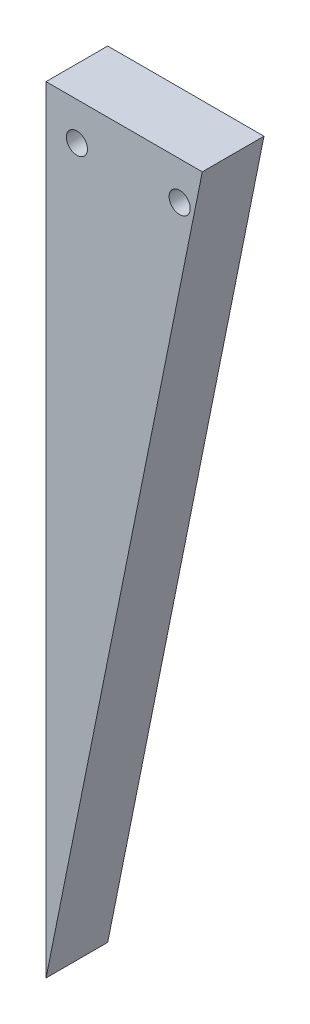
ISO-10303-21;
HEADER;
FILE_DESCRIPTION(('STEP AP214'),'2;1');
FILE_NAME('part.step','',(''),(''),'','','');
FILE_SCHEMA(('AUTOMOTIVE_DESIGN { 1 0 10303 214 1 1 1 1 }'));
ENDSEC;
DATA;
#1=APPLICATION_CONTEXT('core data for automotive mechanical design processes');
#2=APPLICATION_PROTOCOL_DEFINITION('international standard','automotive_design',2000,#1);
#3=PRODUCT_CONTEXT('',#1,'mechanical');
#4=PRODUCT('Part','Part','',(#3));
#5=PRODUCT_RELATED_PRODUCT_CATEGORY('part','',(#4));
#6=PRODUCT_DEFINITION_FORMATION('','',#4);
#7=PRODUCT_DEFINITION_CONTEXT('part definition',#1,'design');
#8=PRODUCT_DEFINITION('design','',#6,#7);
#9=PRODUCT_DEFINITION_SHAPE('','',#8);
#10=(LENGTH_UNIT() NAMED_UNIT(*) SI_UNIT(.MILLI.,.METRE.));
#11=(NAMED_UNIT(*) PLANE_ANGLE_UNIT() SI_UNIT($,.RADIAN.));
#12=(NAMED_UNIT(*) SI_UNIT($,.STERADIAN.) SOLID_ANGLE_UNIT());
#13=UNCERTAINTY_MEASURE_WITH_UNIT(LENGTH_MEASURE(1.E-05),#10,'distance_accuracy_value','');
#14=(GEOMETRIC_REPRESENTATION_CONTEXT(3) GLOBAL_UNCERTAINTY_ASSIGNED_CONTEXT((#13)) GLOBAL_UNIT_ASSIGNED_CONTEXT((#10,
#11,#12)) REPRESENTATION_CONTEXT('',''));
#15=CARTESIAN_POINT('',(0.,0.,0.));
#16=DIRECTION('',(0.,0.,1.));
#17=DIRECTION('',(1.,0.,0.));
#18=AXIS2_PLACEMENT_3D('',#15,#16,#17);
#19=CARTESIAN_POINT('',(24.13,0.,9.525));
#20=DIRECTION('',(0.,-1.,0.));
#21=DIRECTION('',(0.,0.,-1.));
#22=AXIS2_PLACEMENT_3D('',#19,#20,#21);
#23=PLANE('',#22);
#24=DIRECTION('',(-1.,0.,0.));
#25=VECTOR('',#24,1.);
#26=CARTESIAN_POINT('',(24.13,0.,0.));
#27=LINE('',#26,#25);
#28=CARTESIAN_POINT('',(24.13,0.,0.));
#29=VERTEX_POINT('',#28);
#30=CARTESIAN_POINT('',(0.,0.,0.));
#31=VERTEX_POINT('',#30);
#32=EDGE_CURVE('E81',#29,#31,#27,.T.);
#33=ORIENTED_EDGE('',*,*,#32,.T.);
#34=DIRECTION('',(0.,0.,-1.));
#35=VECTOR('',#34,1.);
#36=CARTESIAN_POINT('',(0.,0.,9.525));
#37=LINE('',#36,#35);
#38=CARTESIAN_POINT('',(0.,0.,9.525));
#39=VERTEX_POINT('',#38);
#40=EDGE_CURVE('E11',#39,#31,#37,.T.);
#41=ORIENTED_EDGE('',*,*,#40,.F.);
#42=DIRECTION('',(-1.,0.,0.));
#43=VECTOR('',#42,1.);
#44=CARTESIAN_POINT('',(24.13,0.,9.525));
#45=LINE('',#44,#43);
#46=CARTESIAN_POINT('',(24.13,0.,9.525));
#47=VERTEX_POINT('',#46);
#48=EDGE_CURVE('E74',#47,#39,#45,.T.);
#49=ORIENTED_EDGE('',*,*,#48,.F.);
#50=DIRECTION('',(0.,0.,-1.));
#51=VECTOR('',#50,1.);
#52=CARTESIAN_POINT('',(24.13,0.,9.525));
#53=LINE('',#52,#51);
#54=EDGE_CURVE('E82',#47,#29,#53,.T.);
#55=ORIENTED_EDGE('',*,*,#54,.T.);
#56=EDGE_LOOP('',(#33,#41,#49,#55));
#57=FACE_BOUND('',#56,.T.);
#58=ADVANCED_FACE('F34',(#57),#23,.F.);
#59=CARTESIAN_POINT('',(0.,0.,9.525));
#60=DIRECTION('',(1.,0.,0.));
#61=DIRECTION('',(0.,0.,-1.));
#62=AXIS2_PLACEMENT_3D('',#59,#60,#61);
#63=PLANE('',#62);
#64=DIRECTION('',(0.,-1.,0.));
#65=VECTOR('',#64,1.);
#66=CARTESIAN_POINT('',(0.,0.,0.));
#67=LINE('',#66,#65);
#68=CARTESIAN_POINT('',(0.,-119.888,0.));
#69=VERTEX_POINT('',#68);
#70=EDGE_CURVE('E62',#31,#69,#67,.T.);
#71=ORIENTED_EDGE('',*,*,#70,.T.);
#72=DIRECTION('',(0.,0.,-1.));
#73=VECTOR('',#72,1.);
#74=CARTESIAN_POINT('',(0.,-119.888,9.525));
#75=LINE('',#74,#73);
#76=CARTESIAN_POINT('',(0.,-119.888,9.525));
#77=VERTEX_POINT('',#76);
#78=EDGE_CURVE('E42',#77,#69,#75,.T.);
#79=ORIENTED_EDGE('',*,*,#78,.F.);
#80=DIRECTION('',(0.,-1.,0.));
#81=VECTOR('',#80,1.);
#82=CARTESIAN_POINT('',(0.,0.,9.525));
#83=LINE('',#82,#81);
#84=EDGE_CURVE('E70',#39,#77,#83,.T.);
#85=ORIENTED_EDGE('',*,*,#84,.F.);
#86=ORIENTED_EDGE('',*,*,#40,.T.);
#87=EDGE_LOOP('',(#71,#79,#85,#86));
#88=FACE_BOUND('',#87,.T.);
#89=ADVANCED_FACE('F71',(#88),#63,.F.);
#90=CARTESIAN_POINT('',(0.,-119.888,9.525));
#91=DIRECTION('',(-0.980340290614543,0.197314253407588,0.));
#92=DIRECTION('',(-0.197314253407588,-0.980340290614543,0.));
#93=AXIS2_PLACEMENT_3D('',#90,#91,#92);
#94=PLANE('',#93);
#95=DIRECTION('',(0.197314253407588,0.980340290614543,0.));
#96=VECTOR('',#95,1.);
#97=CARTESIAN_POINT('',(0.,-119.888,0.));
#98=LINE('',#97,#96);
#99=EDGE_CURVE('E67',#69,#29,#98,.T.);
#100=ORIENTED_EDGE('',*,*,#99,.T.);
#101=ORIENTED_EDGE('',*,*,#54,.F.);
#102=DIRECTION('',(0.197314253407588,0.980340290614543,0.));
#103=VECTOR('',#102,1.);
#104=CARTESIAN_POINT('',(0.,-119.888,9.525));
#105=LINE('',#104,#103);
#106=EDGE_CURVE('E50',#77,#47,#105,.T.);
#107=ORIENTED_EDGE('',*,*,#106,.F.);
#108=ORIENTED_EDGE('',*,*,#78,.T.);
#109=EDGE_LOOP('',(#100,#101,#107,#108));
#110=FACE_BOUND('',#109,.T.);
#111=ADVANCED_FACE('F94',(#110),#94,.F.);
#112=CARTESIAN_POINT('',(0.,0.,9.525));
#113=DIRECTION('',(0.,0.,1.));
#114=DIRECTION('',(1.,0.,0.));
#115=AXIS2_PLACEMENT_3D('',#112,#113,#114);
#116=PLANE('',#115);
#117=CARTESIAN_POINT('',(20.6375,-5.842,9.525));
#118=DIRECTION('',(0.,0.,1.));
#119=DIRECTION('',(1.,0.,0.));
#120=AXIS2_PLACEMENT_3D('',#117,#118,#119);
#121=CIRCLE('',#120,1.63194999999999);
#122=CARTESIAN_POINT('',(22.26945,-5.842,9.525));
#123=VERTEX_POINT('',#122);
#124=EDGE_CURVE('E153',#123,#123,#121,.T.);
#125=ORIENTED_EDGE('',*,*,#124,.F.);
#126=EDGE_LOOP('',(#125));
#127=FACE_BOUND('',#126,.T.);
#128=CARTESIAN_POINT('',(4.7625,-5.842,9.525));
#129=DIRECTION('',(0.,0.,1.));
#130=DIRECTION('',(1.,0.,0.));
#131=AXIS2_PLACEMENT_3D('',#128,#129,#130);
#132=CIRCLE('',#131,1.63194999999999);
#133=CARTESIAN_POINT('',(6.39444999999999,-5.842,9.525));
#134=VERTEX_POINT('',#133);
#135=EDGE_CURVE('E88',#134,#134,#132,.T.);
#136=ORIENTED_EDGE('',*,*,#135,.F.);
#137=EDGE_LOOP('',(#136));
#138=FACE_BOUND('',#137,.T.);
#139=ORIENTED_EDGE('',*,*,#48,.T.);
#140=ORIENTED_EDGE('',*,*,#84,.T.);
#141=ORIENTED_EDGE('',*,*,#106,.T.);
#142=EDGE_LOOP('',(#139,#140,#141));
#143=FACE_BOUND('',#142,.T.);
#144=ADVANCED_FACE('F77',(#127,#138,#143),#116,.T.);
#145=CARTESIAN_POINT('',(0.,0.,0.));
#146=DIRECTION('',(0.,0.,1.));
#147=DIRECTION('',(1.,0.,0.));
#148=AXIS2_PLACEMENT_3D('',#145,#146,#147);
#149=PLANE('',#148);
#150=CARTESIAN_POINT('',(20.6375,-5.842,0.));
#151=DIRECTION('',(0.,0.,1.));
#152=DIRECTION('',(1.,0.,0.));
#153=AXIS2_PLACEMENT_3D('',#150,#151,#152);
#154=CIRCLE('',#153,1.63195);
#155=CARTESIAN_POINT('',(22.26945,-5.842,0.));
#156=VERTEX_POINT('',#155);
#157=EDGE_CURVE('E150',#156,#156,#154,.T.);
#158=ORIENTED_EDGE('',*,*,#157,.T.);
#159=EDGE_LOOP('',(#158));
#160=FACE_BOUND('',#159,.T.);
#161=CARTESIAN_POINT('',(4.7625,-5.842,0.));
#162=DIRECTION('',(0.,0.,1.));
#163=DIRECTION('',(1.,0.,0.));
#164=AXIS2_PLACEMENT_3D('',#161,#162,#163);
#165=CIRCLE('',#164,1.63195);
#166=CARTESIAN_POINT('',(6.39445,-5.842,0.));
#167=VERTEX_POINT('',#166);
#168=EDGE_CURVE('E84',#167,#167,#165,.T.);
#169=ORIENTED_EDGE('',*,*,#168,.T.);
#170=EDGE_LOOP('',(#169));
#171=FACE_BOUND('',#170,.T.);
#172=ORIENTED_EDGE('',*,*,#32,.F.);
#173=ORIENTED_EDGE('',*,*,#99,.F.);
#174=ORIENTED_EDGE('',*,*,#70,.F.);
#175=EDGE_LOOP('',(#172,#173,#174));
#176=FACE_BOUND('',#175,.T.);
#177=ADVANCED_FACE('F95',(#160,#171,#176),#149,.F.);
#178=CARTESIAN_POINT('',(4.7625,-5.842,9.525));
#179=DIRECTION('',(0.,0.,1.));
#180=DIRECTION('',(1.,0.,0.));
#181=AXIS2_PLACEMENT_3D('',#178,#179,#180);
#182=CYLINDRICAL_SURFACE('',#181,1.63194999999999);
#183=ORIENTED_EDGE('',*,*,#168,.F.);
#184=EDGE_LOOP('',(#183));
#185=FACE_BOUND('',#184,.T.);
#186=ORIENTED_EDGE('',*,*,#135,.T.);
#187=EDGE_LOOP('',(#186));
#188=FACE_BOUND('',#187,.T.);
#189=ADVANCED_FACE('F97',(#185,#188),#182,.F.);
#190=CARTESIAN_POINT('',(20.6375,-5.842,9.525));
#191=DIRECTION('',(0.,0.,1.));
#192=DIRECTION('',(1.,0.,0.));
#193=AXIS2_PLACEMENT_3D('',#190,#191,#192);
#194=CYLINDRICAL_SURFACE('',#193,1.63194999999999);
#195=ORIENTED_EDGE('',*,*,#157,.F.);
#196=EDGE_LOOP('',(#195));
#197=FACE_BOUND('',#196,.T.);
#198=ORIENTED_EDGE('',*,*,#124,.T.);
#199=EDGE_LOOP('',(#198));
#200=FACE_BOUND('',#199,.T.);
#201=ADVANCED_FACE('F104',(#197,#200),#194,.F.);
#202=CLOSED_SHELL('',(#58,#89,#111,#144,#177,#189,#201));
#203=MANIFOLD_SOLID_BREP('B2',#202);
#204=ADVANCED_BREP_SHAPE_REPRESENTATION('',(#18,#203),#14);
#205=SHAPE_DEFINITION_REPRESENTATION(#9,#204);
ENDSEC;
END-ISO-10303-21;
